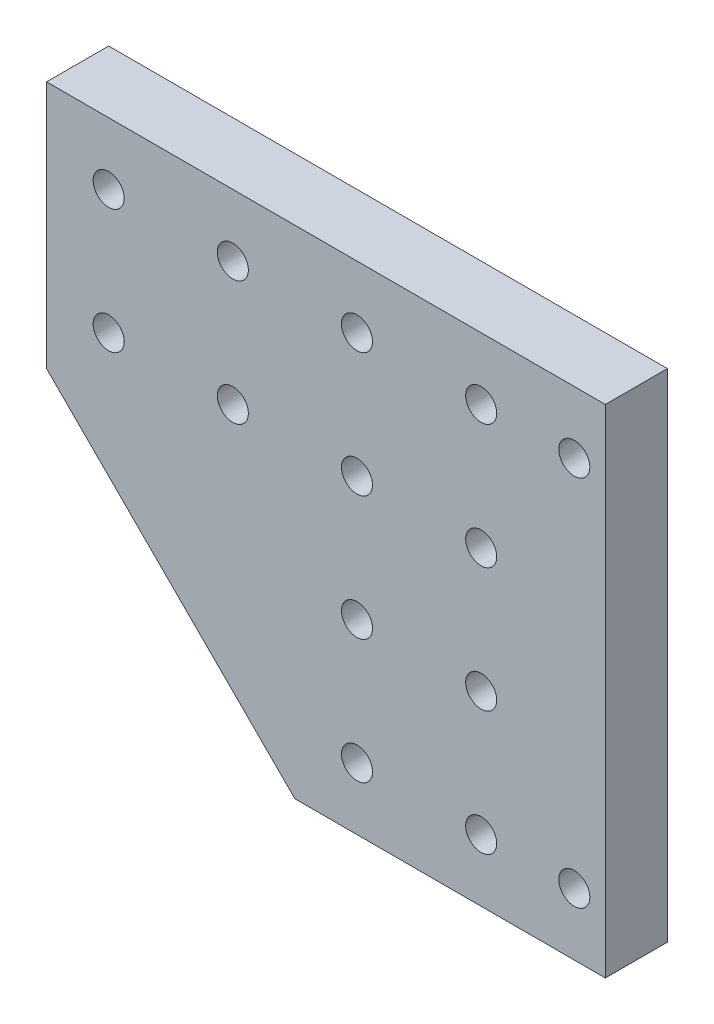
ISO-10303-21;
HEADER;
FILE_DESCRIPTION(('STEP AP214'),'2;1');
FILE_NAME('part.step','',(''),(''),'','','');
FILE_SCHEMA(('AUTOMOTIVE_DESIGN { 1 0 10303 214 1 1 1 1 }'));
ENDSEC;
DATA;
#1=APPLICATION_CONTEXT('core data for automotive mechanical design processes');
#2=APPLICATION_PROTOCOL_DEFINITION('international standard','automotive_design',2000,#1);
#3=PRODUCT_CONTEXT('',#1,'mechanical');
#4=PRODUCT('Part','Part','',(#3));
#5=PRODUCT_RELATED_PRODUCT_CATEGORY('part','',(#4));
#6=PRODUCT_DEFINITION_FORMATION('','',#4);
#7=PRODUCT_DEFINITION_CONTEXT('part definition',#1,'design');
#8=PRODUCT_DEFINITION('design','',#6,#7);
#9=PRODUCT_DEFINITION_SHAPE('','',#8);
#10=(LENGTH_UNIT() NAMED_UNIT(*) SI_UNIT(.MILLI.,.METRE.));
#11=(NAMED_UNIT(*) PLANE_ANGLE_UNIT() SI_UNIT($,.RADIAN.));
#12=(NAMED_UNIT(*) SI_UNIT($,.STERADIAN.) SOLID_ANGLE_UNIT());
#13=UNCERTAINTY_MEASURE_WITH_UNIT(LENGTH_MEASURE(1.E-05),#10,'distance_accuracy_value','');
#14=(GEOMETRIC_REPRESENTATION_CONTEXT(3) GLOBAL_UNCERTAINTY_ASSIGNED_CONTEXT((#13)) GLOBAL_UNIT_ASSIGNED_CONTEXT((#10,
#11,#12)) REPRESENTATION_CONTEXT('',''));
#15=CARTESIAN_POINT('',(0.,0.,0.));
#16=DIRECTION('',(0.,0.,1.));
#17=DIRECTION('',(1.,0.,0.));
#18=AXIS2_PLACEMENT_3D('',#15,#16,#17);
#19=CARTESIAN_POINT('',(-40.,40.,10.));
#20=DIRECTION('',(0.707106781186548,0.707106781186547,0.));
#21=DIRECTION('',(-0.707106781186547,0.707106781186548,0.));
#22=AXIS2_PLACEMENT_3D('',#19,#20,#21);
#23=PLANE('',#22);
#24=DIRECTION('',(0.707106781186547,-0.707106781186548,0.));
#25=VECTOR('',#24,1.);
#26=CARTESIAN_POINT('',(-40.,40.,0.));
#27=LINE('',#26,#25);
#28=CARTESIAN_POINT('',(-40.,40.,0.));
#29=VERTEX_POINT('',#28);
#30=CARTESIAN_POINT('',(0.,0.,0.));
#31=VERTEX_POINT('',#30);
#32=EDGE_CURVE('E122',#29,#31,#27,.T.);
#33=ORIENTED_EDGE('',*,*,#32,.T.);
#34=DIRECTION('',(0.,0.,-1.));
#35=VECTOR('',#34,1.);
#36=CARTESIAN_POINT('',(0.,0.,10.));
#37=LINE('',#36,#35);
#38=CARTESIAN_POINT('',(0.,0.,10.));
#39=VERTEX_POINT('',#38);
#40=EDGE_CURVE('E11',#39,#31,#37,.T.);
#41=ORIENTED_EDGE('',*,*,#40,.F.);
#42=DIRECTION('',(0.707106781186547,-0.707106781186548,0.));
#43=VECTOR('',#42,1.);
#44=CARTESIAN_POINT('',(-40.,40.,10.));
#45=LINE('',#44,#43);
#46=CARTESIAN_POINT('',(-40.,40.,10.));
#47=VERTEX_POINT('',#46);
#48=EDGE_CURVE('E136',#47,#39,#45,.T.);
#49=ORIENTED_EDGE('',*,*,#48,.F.);
#50=DIRECTION('',(0.,0.,-1.));
#51=VECTOR('',#50,1.);
#52=CARTESIAN_POINT('',(-40.,40.,10.));
#53=LINE('',#52,#51);
#54=EDGE_CURVE('E118',#47,#29,#53,.T.);
#55=ORIENTED_EDGE('',*,*,#54,.T.);
#56=EDGE_LOOP('',(#33,#41,#49,#55));
#57=FACE_BOUND('',#56,.T.);
#58=ADVANCED_FACE('F43',(#57),#23,.F.);
#59=CARTESIAN_POINT('',(0.,0.,10.));
#60=DIRECTION('',(0.,1.,0.));
#61=DIRECTION('',(0.,0.,1.));
#62=AXIS2_PLACEMENT_3D('',#59,#60,#61);
#63=PLANE('',#62);
#64=DIRECTION('',(1.,0.,0.));
#65=VECTOR('',#64,1.);
#66=CARTESIAN_POINT('',(0.,0.,0.));
#67=LINE('',#66,#65);
#68=CARTESIAN_POINT('',(50.,0.,0.));
#69=VERTEX_POINT('',#68);
#70=EDGE_CURVE('E126',#31,#69,#67,.T.);
#71=ORIENTED_EDGE('',*,*,#70,.T.);
#72=DIRECTION('',(0.,0.,-1.));
#73=VECTOR('',#72,1.);
#74=CARTESIAN_POINT('',(50.,0.,10.));
#75=LINE('',#74,#73);
#76=CARTESIAN_POINT('',(50.,0.,10.));
#77=VERTEX_POINT('',#76);
#78=EDGE_CURVE('E52',#77,#69,#75,.T.);
#79=ORIENTED_EDGE('',*,*,#78,.F.);
#80=DIRECTION('',(1.,0.,0.));
#81=VECTOR('',#80,1.);
#82=CARTESIAN_POINT('',(0.,0.,10.));
#83=LINE('',#82,#81);
#84=EDGE_CURVE('E94',#39,#77,#83,.T.);
#85=ORIENTED_EDGE('',*,*,#84,.F.);
#86=ORIENTED_EDGE('',*,*,#40,.T.);
#87=EDGE_LOOP('',(#71,#79,#85,#86));
#88=FACE_BOUND('',#87,.T.);
#89=ADVANCED_FACE('F159',(#88),#63,.F.);
#90=CARTESIAN_POINT('',(50.,0.,10.));
#91=DIRECTION('',(-1.,0.,0.));
#92=DIRECTION('',(0.,0.,1.));
#93=AXIS2_PLACEMENT_3D('',#90,#91,#92);
#94=PLANE('',#93);
#95=DIRECTION('',(0.,1.,0.));
#96=VECTOR('',#95,1.);
#97=CARTESIAN_POINT('',(50.,0.,0.));
#98=LINE('',#97,#96);
#99=CARTESIAN_POINT('',(50.,80.,0.));
#100=VERTEX_POINT('',#99);
#101=EDGE_CURVE('E110',#69,#100,#98,.T.);
#102=ORIENTED_EDGE('',*,*,#101,.T.);
#103=DIRECTION('',(0.,0.,-1.));
#104=VECTOR('',#103,1.);
#105=CARTESIAN_POINT('',(50.,80.,10.));
#106=LINE('',#105,#104);
#107=CARTESIAN_POINT('',(50.,80.,10.));
#108=VERTEX_POINT('',#107);
#109=EDGE_CURVE('E107',#108,#100,#106,.T.);
#110=ORIENTED_EDGE('',*,*,#109,.F.);
#111=DIRECTION('',(0.,1.,0.));
#112=VECTOR('',#111,1.);
#113=CARTESIAN_POINT('',(50.,0.,10.));
#114=LINE('',#113,#112);
#115=EDGE_CURVE('E98',#77,#108,#114,.T.);
#116=ORIENTED_EDGE('',*,*,#115,.F.);
#117=ORIENTED_EDGE('',*,*,#78,.T.);
#118=EDGE_LOOP('',(#102,#110,#116,#117));
#119=FACE_BOUND('',#118,.T.);
#120=ADVANCED_FACE('F108',(#119),#94,.F.);
#121=CARTESIAN_POINT('',(50.,80.,10.));
#122=DIRECTION('',(0.,-1.,0.));
#123=DIRECTION('',(1.,0.,0.));
#124=AXIS2_PLACEMENT_3D('',#121,#122,#123);
#125=PLANE('',#124);
#126=DIRECTION('',(-1.,0.,0.));
#127=VECTOR('',#126,1.);
#128=CARTESIAN_POINT('',(50.,80.,0.));
#129=LINE('',#128,#127);
#130=CARTESIAN_POINT('',(-40.,80.,0.));
#131=VERTEX_POINT('',#130);
#132=EDGE_CURVE('E80',#100,#131,#129,.T.);
#133=ORIENTED_EDGE('',*,*,#132,.T.);
#134=DIRECTION('',(0.,0.,-1.));
#135=VECTOR('',#134,1.);
#136=CARTESIAN_POINT('',(-40.,80.,10.));
#137=LINE('',#136,#135);
#138=CARTESIAN_POINT('',(-40.,80.,10.));
#139=VERTEX_POINT('',#138);
#140=EDGE_CURVE('E112',#139,#131,#137,.T.);
#141=ORIENTED_EDGE('',*,*,#140,.F.);
#142=DIRECTION('',(-1.,0.,0.));
#143=VECTOR('',#142,1.);
#144=CARTESIAN_POINT('',(50.,80.,10.));
#145=LINE('',#144,#143);
#146=EDGE_CURVE('E102',#108,#139,#145,.T.);
#147=ORIENTED_EDGE('',*,*,#146,.F.);
#148=ORIENTED_EDGE('',*,*,#109,.T.);
#149=EDGE_LOOP('',(#133,#141,#147,#148));
#150=FACE_BOUND('',#149,.T.);
#151=ADVANCED_FACE('F114',(#150),#125,.F.);
#152=CARTESIAN_POINT('',(-40.,80.,10.));
#153=DIRECTION('',(1.,0.,0.));
#154=DIRECTION('',(0.,1.,0.));
#155=AXIS2_PLACEMENT_3D('',#152,#153,#154);
#156=PLANE('',#155);
#157=DIRECTION('',(0.,-1.,0.));
#158=VECTOR('',#157,1.);
#159=CARTESIAN_POINT('',(-40.,80.,0.));
#160=LINE('',#159,#158);
#161=EDGE_CURVE('E86',#131,#29,#160,.T.);
#162=ORIENTED_EDGE('',*,*,#161,.T.);
#163=ORIENTED_EDGE('',*,*,#54,.F.);
#164=DIRECTION('',(0.,-1.,0.));
#165=VECTOR('',#164,1.);
#166=CARTESIAN_POINT('',(-40.,80.,10.));
#167=LINE('',#166,#165);
#168=EDGE_CURVE('E60',#139,#47,#167,.T.);
#169=ORIENTED_EDGE('',*,*,#168,.F.);
#170=ORIENTED_EDGE('',*,*,#140,.T.);
#171=EDGE_LOOP('',(#162,#163,#169,#170));
#172=FACE_BOUND('',#171,.T.);
#173=ADVANCED_FACE('F147',(#172),#156,.F.);
#174=CARTESIAN_POINT('',(0.,0.,10.));
#175=DIRECTION('',(0.,0.,1.));
#176=DIRECTION('',(1.,0.,0.));
#177=AXIS2_PLACEMENT_3D('',#174,#175,#176);
#178=PLANE('',#177);
#179=CARTESIAN_POINT('',(30.,50.,10.));
#180=DIRECTION('',(0.,0.,1.));
#181=DIRECTION('',(1.,0.,0.));
#182=AXIS2_PLACEMENT_3D('',#179,#180,#181);
#183=CIRCLE('',#182,2.50000000000001);
#184=CARTESIAN_POINT('',(32.5,50.,10.));
#185=VERTEX_POINT('',#184);
#186=EDGE_CURVE('E390',#185,#185,#183,.T.);
#187=ORIENTED_EDGE('',*,*,#186,.F.);
#188=EDGE_LOOP('',(#187));
#189=FACE_BOUND('',#188,.T.);
#190=CARTESIAN_POINT('',(45.,70.,10.));
#191=DIRECTION('',(0.,0.,1.));
#192=DIRECTION('',(1.,0.,0.));
#193=AXIS2_PLACEMENT_3D('',#190,#191,#192);
#194=CIRCLE('',#193,2.5);
#195=CARTESIAN_POINT('',(47.5,70.,10.));
#196=VERTEX_POINT('',#195);
#197=EDGE_CURVE('E395',#196,#196,#194,.T.);
#198=ORIENTED_EDGE('',*,*,#197,.F.);
#199=EDGE_LOOP('',(#198));
#200=FACE_BOUND('',#199,.T.);
#201=CARTESIAN_POINT('',(10.,70.,10.));
#202=DIRECTION('',(0.,0.,1.));
#203=DIRECTION('',(1.,0.,0.));
#204=AXIS2_PLACEMENT_3D('',#201,#202,#203);
#205=CIRCLE('',#204,2.5);
#206=CARTESIAN_POINT('',(12.5,70.,10.));
#207=VERTEX_POINT('',#206);
#208=EDGE_CURVE('E410',#207,#207,#205,.T.);
#209=ORIENTED_EDGE('',*,*,#208,.F.);
#210=EDGE_LOOP('',(#209));
#211=FACE_BOUND('',#210,.T.);
#212=CARTESIAN_POINT('',(30.,70.,10.));
#213=DIRECTION('',(0.,0.,1.));
#214=DIRECTION('',(1.,0.,0.));
#215=AXIS2_PLACEMENT_3D('',#212,#213,#214);
#216=CIRCLE('',#215,2.50000000000001);
#217=CARTESIAN_POINT('',(32.5,70.,10.));
#218=VERTEX_POINT('',#217);
#219=EDGE_CURVE('E405',#218,#218,#216,.T.);
#220=ORIENTED_EDGE('',*,*,#219,.F.);
#221=EDGE_LOOP('',(#220));
#222=FACE_BOUND('',#221,.T.);
#223=CARTESIAN_POINT('',(30.,10.,10.));
#224=DIRECTION('',(0.,0.,1.));
#225=DIRECTION('',(1.,0.,0.));
#226=AXIS2_PLACEMENT_3D('',#223,#224,#225);
#227=CIRCLE('',#226,2.5);
#228=CARTESIAN_POINT('',(32.5,10.,10.));
#229=VERTEX_POINT('',#228);
#230=EDGE_CURVE('E432',#229,#229,#227,.T.);
#231=ORIENTED_EDGE('',*,*,#230,.F.);
#232=EDGE_LOOP('',(#231));
#233=FACE_BOUND('',#232,.T.);
#234=CARTESIAN_POINT('',(10.,30.,10.));
#235=DIRECTION('',(0.,0.,1.));
#236=DIRECTION('',(1.,0.,0.));
#237=AXIS2_PLACEMENT_3D('',#234,#235,#236);
#238=CIRCLE('',#237,2.5);
#239=CARTESIAN_POINT('',(12.5,30.,10.));
#240=VERTEX_POINT('',#239);
#241=EDGE_CURVE('E433',#240,#240,#238,.T.);
#242=ORIENTED_EDGE('',*,*,#241,.F.);
#243=EDGE_LOOP('',(#242));
#244=FACE_BOUND('',#243,.T.);
#245=CARTESIAN_POINT('',(30.,30.,10.));
#246=DIRECTION('',(0.,0.,1.));
#247=DIRECTION('',(1.,0.,0.));
#248=AXIS2_PLACEMENT_3D('',#245,#246,#247);
#249=CIRCLE('',#248,2.50000000000001);
#250=CARTESIAN_POINT('',(32.5,30.,10.));
#251=VERTEX_POINT('',#250);
#252=EDGE_CURVE('E416',#251,#251,#249,.T.);
#253=ORIENTED_EDGE('',*,*,#252,.F.);
#254=EDGE_LOOP('',(#253));
#255=FACE_BOUND('',#254,.T.);
#256=CARTESIAN_POINT('',(10.,50.,10.));
#257=DIRECTION('',(0.,0.,1.));
#258=DIRECTION('',(1.,0.,0.));
#259=AXIS2_PLACEMENT_3D('',#256,#257,#258);
#260=CIRCLE('',#259,2.5);
#261=CARTESIAN_POINT('',(12.5,50.,10.));
#262=VERTEX_POINT('',#261);
#263=EDGE_CURVE('E417',#262,#262,#260,.T.);
#264=ORIENTED_EDGE('',*,*,#263,.F.);
#265=EDGE_LOOP('',(#264));
#266=FACE_BOUND('',#265,.T.);
#267=CARTESIAN_POINT('',(-30.,50.,10.));
#268=DIRECTION('',(0.,0.,1.));
#269=DIRECTION('',(1.,0.,0.));
#270=AXIS2_PLACEMENT_3D('',#267,#268,#269);
#271=CIRCLE('',#270,2.5);
#272=CARTESIAN_POINT('',(-27.5,50.,10.));
#273=VERTEX_POINT('',#272);
#274=EDGE_CURVE('E468',#273,#273,#271,.T.);
#275=ORIENTED_EDGE('',*,*,#274,.F.);
#276=EDGE_LOOP('',(#275));
#277=FACE_BOUND('',#276,.T.);
#278=CARTESIAN_POINT('',(-10.,50.,10.));
#279=DIRECTION('',(0.,0.,1.));
#280=DIRECTION('',(1.,0.,0.));
#281=AXIS2_PLACEMENT_3D('',#278,#279,#280);
#282=CIRCLE('',#281,2.5);
#283=CARTESIAN_POINT('',(-7.5,50.,10.));
#284=VERTEX_POINT('',#283);
#285=EDGE_CURVE('E472',#284,#284,#282,.T.);
#286=ORIENTED_EDGE('',*,*,#285,.F.);
#287=EDGE_LOOP('',(#286));
#288=FACE_BOUND('',#287,.T.);
#289=CARTESIAN_POINT('',(-30.,70.,10.));
#290=DIRECTION('',(0.,0.,1.));
#291=DIRECTION('',(1.,0.,0.));
#292=AXIS2_PLACEMENT_3D('',#289,#290,#291);
#293=CIRCLE('',#292,2.5);
#294=CARTESIAN_POINT('',(-27.5,70.,10.));
#295=VERTEX_POINT('',#294);
#296=EDGE_CURVE('E476',#295,#295,#293,.T.);
#297=ORIENTED_EDGE('',*,*,#296,.F.);
#298=EDGE_LOOP('',(#297));
#299=FACE_BOUND('',#298,.T.);
#300=CARTESIAN_POINT('',(-10.,70.,10.));
#301=DIRECTION('',(0.,0.,1.));
#302=DIRECTION('',(1.,0.,0.));
#303=AXIS2_PLACEMENT_3D('',#300,#301,#302);
#304=CIRCLE('',#303,2.5);
#305=CARTESIAN_POINT('',(-7.5,70.,10.));
#306=VERTEX_POINT('',#305);
#307=EDGE_CURVE('E480',#306,#306,#304,.T.);
#308=ORIENTED_EDGE('',*,*,#307,.F.);
#309=EDGE_LOOP('',(#308));
#310=FACE_BOUND('',#309,.T.);
#311=CARTESIAN_POINT('',(45.,10.,10.));
#312=DIRECTION('',(0.,0.,1.));
#313=DIRECTION('',(1.,0.,0.));
#314=AXIS2_PLACEMENT_3D('',#311,#312,#313);
#315=CIRCLE('',#314,2.5);
#316=CARTESIAN_POINT('',(47.5,10.,10.));
#317=VERTEX_POINT('',#316);
#318=EDGE_CURVE('E483',#317,#317,#315,.T.);
#319=ORIENTED_EDGE('',*,*,#318,.F.);
#320=EDGE_LOOP('',(#319));
#321=FACE_BOUND('',#320,.T.);
#322=CARTESIAN_POINT('',(10.,10.,10.));
#323=DIRECTION('',(0.,0.,1.));
#324=DIRECTION('',(1.,0.,0.));
#325=AXIS2_PLACEMENT_3D('',#322,#323,#324);
#326=CIRCLE('',#325,2.5);
#327=CARTESIAN_POINT('',(12.5,10.,10.));
#328=VERTEX_POINT('',#327);
#329=EDGE_CURVE('E437',#328,#328,#326,.T.);
#330=ORIENTED_EDGE('',*,*,#329,.F.);
#331=EDGE_LOOP('',(#330));
#332=FACE_BOUND('',#331,.T.);
#333=ORIENTED_EDGE('',*,*,#48,.T.);
#334=ORIENTED_EDGE('',*,*,#84,.T.);
#335=ORIENTED_EDGE('',*,*,#115,.T.);
#336=ORIENTED_EDGE('',*,*,#146,.T.);
#337=ORIENTED_EDGE('',*,*,#168,.T.);
#338=EDGE_LOOP('',(#333,#334,#335,#336,#337));
#339=FACE_BOUND('',#338,.T.);
#340=ADVANCED_FACE('F100',(#189,#200,#211,#222,#233,#244,#255,#266,#277,#288,#299,#310,#321,
#332,#339),#178,.T.);
#341=CARTESIAN_POINT('',(0.,0.,0.));
#342=DIRECTION('',(0.,0.,1.));
#343=DIRECTION('',(1.,0.,0.));
#344=AXIS2_PLACEMENT_3D('',#341,#342,#343);
#345=PLANE('',#344);
#346=CARTESIAN_POINT('',(30.,50.,0.));
#347=DIRECTION('',(0.,0.,1.));
#348=DIRECTION('',(1.,0.,0.));
#349=AXIS2_PLACEMENT_3D('',#346,#347,#348);
#350=CIRCLE('',#349,2.50000000000001);
#351=CARTESIAN_POINT('',(32.5,50.,0.));
#352=VERTEX_POINT('',#351);
#353=EDGE_CURVE('E393',#352,#352,#350,.F.);
#354=ORIENTED_EDGE('',*,*,#353,.F.);
#355=EDGE_LOOP('',(#354));
#356=FACE_BOUND('',#355,.T.);
#357=CARTESIAN_POINT('',(45.,70.,0.));
#358=DIRECTION('',(0.,0.,1.));
#359=DIRECTION('',(1.,0.,0.));
#360=AXIS2_PLACEMENT_3D('',#357,#358,#359);
#361=CIRCLE('',#360,2.5);
#362=CARTESIAN_POINT('',(47.5,70.,0.));
#363=VERTEX_POINT('',#362);
#364=EDGE_CURVE('E402',#363,#363,#361,.F.);
#365=ORIENTED_EDGE('',*,*,#364,.F.);
#366=EDGE_LOOP('',(#365));
#367=FACE_BOUND('',#366,.T.);
#368=CARTESIAN_POINT('',(10.,70.,0.));
#369=DIRECTION('',(0.,0.,1.));
#370=DIRECTION('',(1.,0.,0.));
#371=AXIS2_PLACEMENT_3D('',#368,#369,#370);
#372=CIRCLE('',#371,2.5);
#373=CARTESIAN_POINT('',(12.5,70.,0.));
#374=VERTEX_POINT('',#373);
#375=EDGE_CURVE('E496',#374,#374,#372,.F.);
#376=ORIENTED_EDGE('',*,*,#375,.F.);
#377=EDGE_LOOP('',(#376));
#378=FACE_BOUND('',#377,.T.);
#379=CARTESIAN_POINT('',(30.,70.,0.));
#380=DIRECTION('',(0.,0.,1.));
#381=DIRECTION('',(1.,0.,0.));
#382=AXIS2_PLACEMENT_3D('',#379,#380,#381);
#383=CIRCLE('',#382,2.50000000000001);
#384=CARTESIAN_POINT('',(32.5,70.,0.));
#385=VERTEX_POINT('',#384);
#386=EDGE_CURVE('E502',#385,#385,#383,.F.);
#387=ORIENTED_EDGE('',*,*,#386,.F.);
#388=EDGE_LOOP('',(#387));
#389=FACE_BOUND('',#388,.T.);
#390=CARTESIAN_POINT('',(30.,10.,0.));
#391=DIRECTION('',(0.,0.,1.));
#392=DIRECTION('',(1.,0.,0.));
#393=AXIS2_PLACEMENT_3D('',#390,#391,#392);
#394=CIRCLE('',#393,2.5);
#395=CARTESIAN_POINT('',(32.5,10.,0.));
#396=VERTEX_POINT('',#395);
#397=EDGE_CURVE('E428',#396,#396,#394,.F.);
#398=ORIENTED_EDGE('',*,*,#397,.F.);
#399=EDGE_LOOP('',(#398));
#400=FACE_BOUND('',#399,.T.);
#401=CARTESIAN_POINT('',(10.,30.,0.));
#402=DIRECTION('',(0.,0.,1.));
#403=DIRECTION('',(1.,0.,0.));
#404=AXIS2_PLACEMENT_3D('',#401,#402,#403);
#405=CIRCLE('',#404,2.5);
#406=CARTESIAN_POINT('',(12.5,30.,0.));
#407=VERTEX_POINT('',#406);
#408=EDGE_CURVE('E421',#407,#407,#405,.F.);
#409=ORIENTED_EDGE('',*,*,#408,.F.);
#410=EDGE_LOOP('',(#409));
#411=FACE_BOUND('',#410,.T.);
#412=CARTESIAN_POINT('',(30.,30.,0.));
#413=DIRECTION('',(0.,0.,1.));
#414=DIRECTION('',(1.,0.,0.));
#415=AXIS2_PLACEMENT_3D('',#412,#413,#414);
#416=CIRCLE('',#415,2.50000000000001);
#417=CARTESIAN_POINT('',(32.5,30.,0.));
#418=VERTEX_POINT('',#417);
#419=EDGE_CURVE('E412',#418,#418,#416,.F.);
#420=ORIENTED_EDGE('',*,*,#419,.F.);
#421=EDGE_LOOP('',(#420));
#422=FACE_BOUND('',#421,.T.);
#423=CARTESIAN_POINT('',(10.,50.,0.));
#424=DIRECTION('',(0.,0.,1.));
#425=DIRECTION('',(1.,0.,0.));
#426=AXIS2_PLACEMENT_3D('',#423,#424,#425);
#427=CIRCLE('',#426,2.5);
#428=CARTESIAN_POINT('',(12.5,50.,0.));
#429=VERTEX_POINT('',#428);
#430=EDGE_CURVE('E399',#429,#429,#427,.F.);
#431=ORIENTED_EDGE('',*,*,#430,.F.);
#432=EDGE_LOOP('',(#431));
#433=FACE_BOUND('',#432,.T.);
#434=CARTESIAN_POINT('',(-30.,50.,0.));
#435=DIRECTION('',(0.,0.,1.));
#436=DIRECTION('',(1.,0.,0.));
#437=AXIS2_PLACEMENT_3D('',#434,#435,#436);
#438=CIRCLE('',#437,2.5);
#439=CARTESIAN_POINT('',(-27.5,50.,0.));
#440=VERTEX_POINT('',#439);
#441=EDGE_CURVE('E510',#440,#440,#438,.F.);
#442=ORIENTED_EDGE('',*,*,#441,.F.);
#443=EDGE_LOOP('',(#442));
#444=FACE_BOUND('',#443,.T.);
#445=CARTESIAN_POINT('',(-10.,50.,0.));
#446=DIRECTION('',(0.,0.,1.));
#447=DIRECTION('',(1.,0.,0.));
#448=AXIS2_PLACEMENT_3D('',#445,#446,#447);
#449=CIRCLE('',#448,2.5);
#450=CARTESIAN_POINT('',(-7.5,50.,0.));
#451=VERTEX_POINT('',#450);
#452=EDGE_CURVE('E516',#451,#451,#449,.F.);
#453=ORIENTED_EDGE('',*,*,#452,.F.);
#454=EDGE_LOOP('',(#453));
#455=FACE_BOUND('',#454,.T.);
#456=CARTESIAN_POINT('',(-30.,70.,0.));
#457=DIRECTION('',(0.,0.,1.));
#458=DIRECTION('',(1.,0.,0.));
#459=AXIS2_PLACEMENT_3D('',#456,#457,#458);
#460=CIRCLE('',#459,2.5);
#461=CARTESIAN_POINT('',(-27.5,70.,0.));
#462=VERTEX_POINT('',#461);
#463=EDGE_CURVE('E522',#462,#462,#460,.F.);
#464=ORIENTED_EDGE('',*,*,#463,.F.);
#465=EDGE_LOOP('',(#464));
#466=FACE_BOUND('',#465,.T.);
#467=CARTESIAN_POINT('',(-10.,70.,0.));
#468=DIRECTION('',(0.,0.,1.));
#469=DIRECTION('',(1.,0.,0.));
#470=AXIS2_PLACEMENT_3D('',#467,#468,#469);
#471=CIRCLE('',#470,2.5);
#472=CARTESIAN_POINT('',(-7.5,70.,0.));
#473=VERTEX_POINT('',#472);
#474=EDGE_CURVE('E485',#473,#473,#471,.F.);
#475=ORIENTED_EDGE('',*,*,#474,.F.);
#476=EDGE_LOOP('',(#475));
#477=FACE_BOUND('',#476,.T.);
#478=CARTESIAN_POINT('',(45.,10.,0.));
#479=DIRECTION('',(0.,0.,1.));
#480=DIRECTION('',(1.,0.,0.));
#481=AXIS2_PLACEMENT_3D('',#478,#479,#480);
#482=CIRCLE('',#481,2.5);
#483=CARTESIAN_POINT('',(47.5,10.,0.));
#484=VERTEX_POINT('',#483);
#485=EDGE_CURVE('E486',#484,#484,#482,.F.);
#486=ORIENTED_EDGE('',*,*,#485,.F.);
#487=EDGE_LOOP('',(#486));
#488=FACE_BOUND('',#487,.T.);
#489=CARTESIAN_POINT('',(10.,10.,0.));
#490=DIRECTION('',(0.,0.,1.));
#491=DIRECTION('',(1.,0.,0.));
#492=AXIS2_PLACEMENT_3D('',#489,#490,#491);
#493=CIRCLE('',#492,2.5);
#494=CARTESIAN_POINT('',(12.5,10.,0.));
#495=VERTEX_POINT('',#494);
#496=EDGE_CURVE('E127',#495,#495,#493,.F.);
#497=ORIENTED_EDGE('',*,*,#496,.F.);
#498=EDGE_LOOP('',(#497));
#499=FACE_BOUND('',#498,.T.);
#500=ORIENTED_EDGE('',*,*,#32,.F.);
#501=ORIENTED_EDGE('',*,*,#161,.F.);
#502=ORIENTED_EDGE('',*,*,#132,.F.);
#503=ORIENTED_EDGE('',*,*,#101,.F.);
#504=ORIENTED_EDGE('',*,*,#70,.F.);
#505=EDGE_LOOP('',(#500,#501,#502,#503,#504));
#506=FACE_BOUND('',#505,.T.);
#507=ADVANCED_FACE('F143',(#356,#367,#378,#389,#400,#411,#422,#433,#444,#455,#466,#477,#488,
#499,#506),#345,.F.);
#508=CARTESIAN_POINT('',(10.,10.,-0.000999999999999265));
#509=DIRECTION('',(0.,0.,1.));
#510=DIRECTION('',(1.,0.,0.));
#511=AXIS2_PLACEMENT_3D('',#508,#509,#510);
#512=CYLINDRICAL_SURFACE('',#511,2.5);
#513=ORIENTED_EDGE('',*,*,#329,.T.);
#514=EDGE_LOOP('',(#513));
#515=FACE_BOUND('',#514,.T.);
#516=ORIENTED_EDGE('',*,*,#496,.T.);
#517=EDGE_LOOP('',(#516));
#518=FACE_BOUND('',#517,.T.);
#519=ADVANCED_FACE('F195',(#515,#518),#512,.F.);
#520=CARTESIAN_POINT('',(45.,10.,-0.000999999999999265));
#521=DIRECTION('',(0.,0.,1.));
#522=DIRECTION('',(1.,0.,0.));
#523=AXIS2_PLACEMENT_3D('',#520,#521,#522);
#524=CYLINDRICAL_SURFACE('',#523,2.5);
#525=ORIENTED_EDGE('',*,*,#318,.T.);
#526=EDGE_LOOP('',(#525));
#527=FACE_BOUND('',#526,.T.);
#528=ORIENTED_EDGE('',*,*,#485,.T.);
#529=EDGE_LOOP('',(#528));
#530=FACE_BOUND('',#529,.T.);
#531=ADVANCED_FACE('F205',(#527,#530),#524,.F.);
#532=CARTESIAN_POINT('',(-10.,70.,-0.000999999999999265));
#533=DIRECTION('',(0.,0.,1.));
#534=DIRECTION('',(1.,0.,0.));
#535=AXIS2_PLACEMENT_3D('',#532,#533,#534);
#536=CYLINDRICAL_SURFACE('',#535,2.5);
#537=ORIENTED_EDGE('',*,*,#307,.T.);
#538=EDGE_LOOP('',(#537));
#539=FACE_BOUND('',#538,.T.);
#540=ORIENTED_EDGE('',*,*,#474,.T.);
#541=EDGE_LOOP('',(#540));
#542=FACE_BOUND('',#541,.T.);
#543=ADVANCED_FACE('F216',(#539,#542),#536,.F.);
#544=CARTESIAN_POINT('',(-30.,70.,-0.000999999999999265));
#545=DIRECTION('',(0.,0.,1.));
#546=DIRECTION('',(1.,0.,0.));
#547=AXIS2_PLACEMENT_3D('',#544,#545,#546);
#548=CYLINDRICAL_SURFACE('',#547,2.5);
#549=ORIENTED_EDGE('',*,*,#296,.T.);
#550=EDGE_LOOP('',(#549));
#551=FACE_BOUND('',#550,.T.);
#552=ORIENTED_EDGE('',*,*,#463,.T.);
#553=EDGE_LOOP('',(#552));
#554=FACE_BOUND('',#553,.T.);
#555=ADVANCED_FACE('F227',(#551,#554),#548,.F.);
#556=CARTESIAN_POINT('',(-10.,50.,-0.000999999999999265));
#557=DIRECTION('',(0.,0.,1.));
#558=DIRECTION('',(1.,0.,0.));
#559=AXIS2_PLACEMENT_3D('',#556,#557,#558);
#560=CYLINDRICAL_SURFACE('',#559,2.5);
#561=ORIENTED_EDGE('',*,*,#285,.T.);
#562=EDGE_LOOP('',(#561));
#563=FACE_BOUND('',#562,.T.);
#564=ORIENTED_EDGE('',*,*,#452,.T.);
#565=EDGE_LOOP('',(#564));
#566=FACE_BOUND('',#565,.T.);
#567=ADVANCED_FACE('F238',(#563,#566),#560,.F.);
#568=CARTESIAN_POINT('',(-30.,50.,-0.000999999999999265));
#569=DIRECTION('',(0.,0.,1.));
#570=DIRECTION('',(1.,0.,0.));
#571=AXIS2_PLACEMENT_3D('',#568,#569,#570);
#572=CYLINDRICAL_SURFACE('',#571,2.5);
#573=ORIENTED_EDGE('',*,*,#274,.T.);
#574=EDGE_LOOP('',(#573));
#575=FACE_BOUND('',#574,.T.);
#576=ORIENTED_EDGE('',*,*,#441,.T.);
#577=EDGE_LOOP('',(#576));
#578=FACE_BOUND('',#577,.T.);
#579=ADVANCED_FACE('F249',(#575,#578),#572,.F.);
#580=CARTESIAN_POINT('',(10.,50.,-0.000999999999999265));
#581=DIRECTION('',(0.,0.,1.));
#582=DIRECTION('',(1.,0.,0.));
#583=AXIS2_PLACEMENT_3D('',#580,#581,#582);
#584=CYLINDRICAL_SURFACE('',#583,2.5);
#585=ORIENTED_EDGE('',*,*,#263,.T.);
#586=EDGE_LOOP('',(#585));
#587=FACE_BOUND('',#586,.T.);
#588=ORIENTED_EDGE('',*,*,#430,.T.);
#589=EDGE_LOOP('',(#588));
#590=FACE_BOUND('',#589,.T.);
#591=ADVANCED_FACE('F260',(#587,#590),#584,.F.);
#592=CARTESIAN_POINT('',(30.,30.,-0.000999999999999265));
#593=DIRECTION('',(0.,0.,1.));
#594=DIRECTION('',(1.,0.,0.));
#595=AXIS2_PLACEMENT_3D('',#592,#593,#594);
#596=CYLINDRICAL_SURFACE('',#595,2.50000000000001);
#597=ORIENTED_EDGE('',*,*,#252,.T.);
#598=EDGE_LOOP('',(#597));
#599=FACE_BOUND('',#598,.T.);
#600=ORIENTED_EDGE('',*,*,#419,.T.);
#601=EDGE_LOOP('',(#600));
#602=FACE_BOUND('',#601,.T.);
#603=ADVANCED_FACE('F271',(#599,#602),#596,.F.);
#604=CARTESIAN_POINT('',(10.,30.,-0.000999999999999265));
#605=DIRECTION('',(0.,0.,1.));
#606=DIRECTION('',(1.,0.,0.));
#607=AXIS2_PLACEMENT_3D('',#604,#605,#606);
#608=CYLINDRICAL_SURFACE('',#607,2.5);
#609=ORIENTED_EDGE('',*,*,#241,.T.);
#610=EDGE_LOOP('',(#609));
#611=FACE_BOUND('',#610,.T.);
#612=ORIENTED_EDGE('',*,*,#408,.T.);
#613=EDGE_LOOP('',(#612));
#614=FACE_BOUND('',#613,.T.);
#615=ADVANCED_FACE('F282',(#611,#614),#608,.F.);
#616=CARTESIAN_POINT('',(30.,10.,-0.000999999999999265));
#617=DIRECTION('',(0.,0.,1.));
#618=DIRECTION('',(1.,0.,0.));
#619=AXIS2_PLACEMENT_3D('',#616,#617,#618);
#620=CYLINDRICAL_SURFACE('',#619,2.5);
#621=ORIENTED_EDGE('',*,*,#230,.T.);
#622=EDGE_LOOP('',(#621));
#623=FACE_BOUND('',#622,.T.);
#624=ORIENTED_EDGE('',*,*,#397,.T.);
#625=EDGE_LOOP('',(#624));
#626=FACE_BOUND('',#625,.T.);
#627=ADVANCED_FACE('F293',(#623,#626),#620,.F.);
#628=CARTESIAN_POINT('',(30.,70.,-0.000999999999999265));
#629=DIRECTION('',(0.,0.,1.));
#630=DIRECTION('',(1.,0.,0.));
#631=AXIS2_PLACEMENT_3D('',#628,#629,#630);
#632=CYLINDRICAL_SURFACE('',#631,2.50000000000001);
#633=ORIENTED_EDGE('',*,*,#219,.T.);
#634=EDGE_LOOP('',(#633));
#635=FACE_BOUND('',#634,.T.);
#636=ORIENTED_EDGE('',*,*,#386,.T.);
#637=EDGE_LOOP('',(#636));
#638=FACE_BOUND('',#637,.T.);
#639=ADVANCED_FACE('F304',(#635,#638),#632,.F.);
#640=CARTESIAN_POINT('',(10.,70.,-0.000999999999999265));
#641=DIRECTION('',(0.,0.,1.));
#642=DIRECTION('',(1.,0.,0.));
#643=AXIS2_PLACEMENT_3D('',#640,#641,#642);
#644=CYLINDRICAL_SURFACE('',#643,2.5);
#645=ORIENTED_EDGE('',*,*,#208,.T.);
#646=EDGE_LOOP('',(#645));
#647=FACE_BOUND('',#646,.T.);
#648=ORIENTED_EDGE('',*,*,#375,.T.);
#649=EDGE_LOOP('',(#648));
#650=FACE_BOUND('',#649,.T.);
#651=ADVANCED_FACE('F315',(#647,#650),#644,.F.);
#652=CARTESIAN_POINT('',(45.,70.,-0.000999999999999265));
#653=DIRECTION('',(0.,0.,1.));
#654=DIRECTION('',(1.,0.,0.));
#655=AXIS2_PLACEMENT_3D('',#652,#653,#654);
#656=CYLINDRICAL_SURFACE('',#655,2.5);
#657=ORIENTED_EDGE('',*,*,#197,.T.);
#658=EDGE_LOOP('',(#657));
#659=FACE_BOUND('',#658,.T.);
#660=ORIENTED_EDGE('',*,*,#364,.T.);
#661=EDGE_LOOP('',(#660));
#662=FACE_BOUND('',#661,.T.);
#663=ADVANCED_FACE('F326',(#659,#662),#656,.F.);
#664=CARTESIAN_POINT('',(30.,50.,-0.000999999999999265));
#665=DIRECTION('',(0.,0.,1.));
#666=DIRECTION('',(1.,0.,0.));
#667=AXIS2_PLACEMENT_3D('',#664,#665,#666);
#668=CYLINDRICAL_SURFACE('',#667,2.50000000000001);
#669=ORIENTED_EDGE('',*,*,#186,.T.);
#670=EDGE_LOOP('',(#669));
#671=FACE_BOUND('',#670,.T.);
#672=ORIENTED_EDGE('',*,*,#353,.T.);
#673=EDGE_LOOP('',(#672));
#674=FACE_BOUND('',#673,.T.);
#675=ADVANCED_FACE('F337',(#671,#674),#668,.F.);
#676=CLOSED_SHELL('',(#58,#89,#120,#151,#173,#340,#507,#519,#531,#543,#555,#567,#579,#591,#603,
#615,#627,#639,#651,#663,#675));
#677=MANIFOLD_SOLID_BREP('B2',#676);
#678=ADVANCED_BREP_SHAPE_REPRESENTATION('',(#18,#677),#14);
#679=SHAPE_DEFINITION_REPRESENTATION(#9,#678);
ENDSEC;
END-ISO-10303-21;
